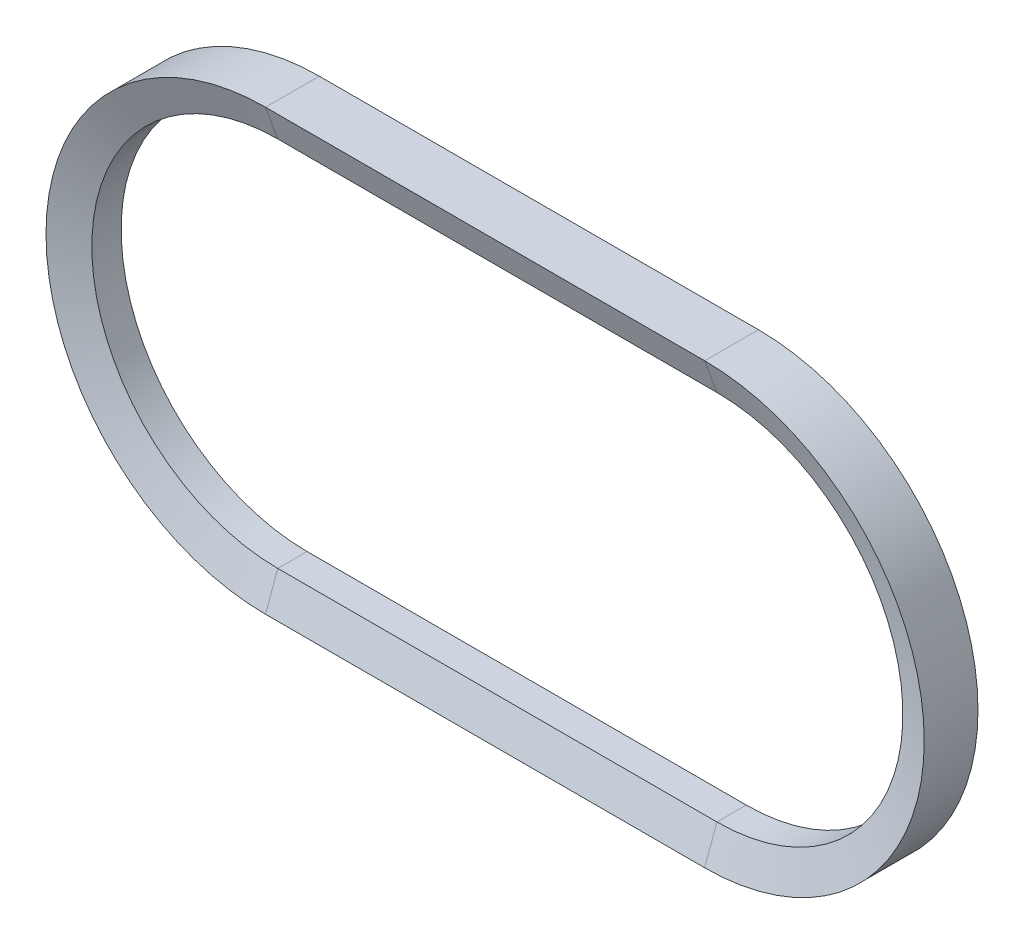
ISO-10303-21;
HEADER;
FILE_DESCRIPTION(('STEP AP214'),'2;1');
FILE_NAME('part.step','',(''),(''),'','','');
FILE_SCHEMA(('AUTOMOTIVE_DESIGN { 1 0 10303 214 1 1 1 1 }'));
ENDSEC;
DATA;
#1=APPLICATION_CONTEXT('core data for automotive mechanical design processes');
#2=APPLICATION_PROTOCOL_DEFINITION('international standard','automotive_design',2000,#1);
#3=PRODUCT_CONTEXT('',#1,'mechanical');
#4=PRODUCT('Part','Part','',(#3));
#5=PRODUCT_RELATED_PRODUCT_CATEGORY('part','',(#4));
#6=PRODUCT_DEFINITION_FORMATION('','',#4);
#7=PRODUCT_DEFINITION_CONTEXT('part definition',#1,'design');
#8=PRODUCT_DEFINITION('design','',#6,#7);
#9=PRODUCT_DEFINITION_SHAPE('','',#8);
#10=(LENGTH_UNIT() NAMED_UNIT(*) SI_UNIT(.MILLI.,.METRE.));
#11=(NAMED_UNIT(*) PLANE_ANGLE_UNIT() SI_UNIT($,.RADIAN.));
#12=(NAMED_UNIT(*) SI_UNIT($,.STERADIAN.) SOLID_ANGLE_UNIT());
#13=UNCERTAINTY_MEASURE_WITH_UNIT(LENGTH_MEASURE(1.E-05),#10,'distance_accuracy_value','');
#14=(GEOMETRIC_REPRESENTATION_CONTEXT(3) GLOBAL_UNCERTAINTY_ASSIGNED_CONTEXT((#13)) GLOBAL_UNIT_ASSIGNED_CONTEXT((#10,
#11,#12)) REPRESENTATION_CONTEXT('',''));
#15=CARTESIAN_POINT('',(0.,0.,0.));
#16=DIRECTION('',(0.,0.,1.));
#17=DIRECTION('',(1.,0.,0.));
#18=AXIS2_PLACEMENT_3D('',#15,#16,#17);
#19=CARTESIAN_POINT('',(0.,51.8710870286063,-6.35));
#20=DIRECTION('',(0.,-1.,0.));
#21=DIRECTION('',(1.,0.,0.));
#22=AXIS2_PLACEMENT_3D('',#19,#20,#21);
#23=PLANE('',#22);
#24=DIRECTION('',(-1.,0.,0.));
#25=VECTOR('',#24,1.);
#26=CARTESIAN_POINT('',(0.,51.8710870286063,6.35));
#27=LINE('',#26,#25);
#28=CARTESIAN_POINT('',(51.8710870286066,51.871087028606,6.35));
#29=VERTEX_POINT('',#28);
#30=CARTESIAN_POINT('',(-51.8710870286066,51.8710870286062,6.35));
#31=VERTEX_POINT('',#30);
#32=EDGE_CURVE('E141',#29,#31,#27,.T.);
#33=ORIENTED_EDGE('',*,*,#32,.F.);
#34=DIRECTION('',(0.,0.,1.));
#35=VECTOR('',#34,1.);
#36=CARTESIAN_POINT('',(51.8710870286066,51.871087028606,-6.35));
#37=LINE('',#36,#35);
#38=CARTESIAN_POINT('',(51.8710870286066,51.871087028606,-6.35));
#39=VERTEX_POINT('',#38);
#40=EDGE_CURVE('E130',#39,#29,#37,.T.);
#41=ORIENTED_EDGE('',*,*,#40,.F.);
#42=DIRECTION('',(-1.,0.,0.));
#43=VECTOR('',#42,1.);
#44=CARTESIAN_POINT('',(0.,51.8710870286063,-6.35));
#45=LINE('',#44,#43);
#46=CARTESIAN_POINT('',(-51.8710870286066,51.8710870286062,-6.35));
#47=VERTEX_POINT('',#46);
#48=EDGE_CURVE('E126',#39,#47,#45,.T.);
#49=ORIENTED_EDGE('',*,*,#48,.T.);
#50=DIRECTION('',(0.,0.,1.));
#51=VECTOR('',#50,1.);
#52=CARTESIAN_POINT('',(-51.8710870286066,51.8710870286062,-6.35));
#53=LINE('',#52,#51);
#54=EDGE_CURVE('E128',#47,#31,#53,.T.);
#55=ORIENTED_EDGE('',*,*,#54,.T.);
#56=EDGE_LOOP('',(#33,#41,#49,#55));
#57=FACE_BOUND('',#56,.T.);
#58=ADVANCED_FACE('F32',(#57),#23,.F.);
#59=CARTESIAN_POINT('',(0.,51.8710870286063,6.35));
#60=DIRECTION('',(0.,0.34202014332567,-0.939692620785908));
#61=DIRECTION('',(0.,0.939692620785908,0.34202014332567));
#62=AXIS2_PLACEMENT_3D('',#59,#60,#61);
#63=PLANE('',#62);
#64=DIRECTION('',(-1.,0.,0.));
#65=VECTOR('',#64,1.);
#66=CARTESIAN_POINT('',(0.,43.9335870286063,3.46098626551201));
#67=LINE('',#66,#65);
#68=CARTESIAN_POINT('',(51.8710870286066,43.933587028606,3.46098626551201));
#69=VERTEX_POINT('',#68);
#70=CARTESIAN_POINT('',(-51.8710870286066,43.9335870286063,3.46098626551201));
#71=VERTEX_POINT('',#70);
#72=EDGE_CURVE('E56',#69,#71,#67,.T.);
#73=ORIENTED_EDGE('',*,*,#72,.F.);
#74=DIRECTION('',(0.,-0.939692620785908,-0.34202014332567));
#75=VECTOR('',#74,1.);
#76=CARTESIAN_POINT('',(51.8710870286066,51.871087028606,6.35));
#77=LINE('',#76,#75);
#78=EDGE_CURVE('E168',#29,#69,#77,.T.);
#79=ORIENTED_EDGE('',*,*,#78,.F.);
#80=ORIENTED_EDGE('',*,*,#32,.T.);
#81=DIRECTION('',(0.,-0.939692620785908,-0.34202014332567));
#82=VECTOR('',#81,1.);
#83=CARTESIAN_POINT('',(-51.8710870286066,51.8710870286062,6.35));
#84=LINE('',#83,#82);
#85=EDGE_CURVE('E171',#31,#71,#84,.T.);
#86=ORIENTED_EDGE('',*,*,#85,.T.);
#87=EDGE_LOOP('',(#73,#79,#80,#86));
#88=FACE_BOUND('',#87,.T.);
#89=ADVANCED_FACE('F213',(#88),#63,.F.);
#90=CARTESIAN_POINT('',(0.,43.9335870286063,3.46098626551201));
#91=DIRECTION('',(0.,1.,0.));
#92=DIRECTION('',(-1.,0.,0.));
#93=AXIS2_PLACEMENT_3D('',#90,#91,#92);
#94=PLANE('',#93);
#95=DIRECTION('',(-1.,0.,0.));
#96=VECTOR('',#95,1.);
#97=CARTESIAN_POINT('',(0.,43.9335870286063,-3.46098626551201));
#98=LINE('',#97,#96);
#99=CARTESIAN_POINT('',(51.8710870286066,43.933587028606,-3.46098626551201));
#100=VERTEX_POINT('',#99);
#101=CARTESIAN_POINT('',(-51.8710870286066,43.9335870286063,-3.46098626551201));
#102=VERTEX_POINT('',#101);
#103=EDGE_CURVE('E47',#100,#102,#98,.T.);
#104=ORIENTED_EDGE('',*,*,#103,.F.);
#105=DIRECTION('',(0.,0.,-1.));
#106=VECTOR('',#105,1.);
#107=CARTESIAN_POINT('',(51.8710870286066,43.933587028606,3.46098626551201));
#108=LINE('',#107,#106);
#109=EDGE_CURVE('E186',#69,#100,#108,.T.);
#110=ORIENTED_EDGE('',*,*,#109,.F.);
#111=ORIENTED_EDGE('',*,*,#72,.T.);
#112=DIRECTION('',(0.,0.,-1.));
#113=VECTOR('',#112,1.);
#114=CARTESIAN_POINT('',(-51.8710870286066,43.9335870286063,3.46098626551201));
#115=LINE('',#114,#113);
#116=EDGE_CURVE('E174',#71,#102,#115,.T.);
#117=ORIENTED_EDGE('',*,*,#116,.T.);
#118=EDGE_LOOP('',(#104,#110,#111,#117));
#119=FACE_BOUND('',#118,.T.);
#120=ADVANCED_FACE('F212',(#119),#94,.F.);
#121=CARTESIAN_POINT('',(0.,51.8710870286063,-6.35));
#122=DIRECTION('',(0.,0.34202014332567,0.939692620785908));
#123=DIRECTION('',(0.,-0.939692620785908,0.34202014332567));
#124=AXIS2_PLACEMENT_3D('',#121,#122,#123);
#125=PLANE('',#124);
#126=DIRECTION('',(0.,0.939692620785908,-0.34202014332567));
#127=VECTOR('',#126,1.);
#128=CARTESIAN_POINT('',(-51.8710870286066,51.8710870286062,-6.35));
#129=LINE('',#128,#127);
#130=EDGE_CURVE('E144',#102,#47,#129,.T.);
#131=ORIENTED_EDGE('',*,*,#130,.T.);
#132=ORIENTED_EDGE('',*,*,#48,.F.);
#133=DIRECTION('',(0.,0.939692620785908,-0.34202014332567));
#134=VECTOR('',#133,1.);
#135=CARTESIAN_POINT('',(51.8710870286066,51.871087028606,-6.35));
#136=LINE('',#135,#134);
#137=EDGE_CURVE('E11',#100,#39,#136,.T.);
#138=ORIENTED_EDGE('',*,*,#137,.F.);
#139=ORIENTED_EDGE('',*,*,#103,.T.);
#140=EDGE_LOOP('',(#131,#132,#138,#139));
#141=FACE_BOUND('',#140,.T.);
#142=ADVANCED_FACE('F145',(#141),#125,.F.);
#143=CARTESIAN_POINT('',(-51.8710870286066,-2.77555756156289E-13,0.));
#144=DIRECTION('',(0.,0.,1.));
#145=DIRECTION('',(1.,0.,0.));
#146=AXIS2_PLACEMENT_3D('',#143,#144,#145);
#147=CYLINDRICAL_SURFACE('',#146,51.8710870286063);
#148=CARTESIAN_POINT('',(-51.8710870286066,-2.77555756156289E-13,6.35));
#149=DIRECTION('',(0.,0.,1.));
#150=DIRECTION('',(0.,1.,0.));
#151=AXIS2_PLACEMENT_3D('',#148,#149,#150);
#152=CIRCLE('',#151,51.8710870286063);
#153=CARTESIAN_POINT('',(-51.8710870286066,-51.8710870286066,6.35));
#154=VERTEX_POINT('',#153);
#155=EDGE_CURVE('E114',#31,#154,#152,.T.);
#156=ORIENTED_EDGE('',*,*,#155,.F.);
#157=ORIENTED_EDGE('',*,*,#54,.F.);
#158=CARTESIAN_POINT('',(-51.8710870286066,-2.77555756156289E-13,-6.35));
#159=DIRECTION('',(0.,0.,1.));
#160=DIRECTION('',(0.,1.,0.));
#161=AXIS2_PLACEMENT_3D('',#158,#159,#160);
#162=CIRCLE('',#161,51.8710870286063);
#163=CARTESIAN_POINT('',(-51.8710870286066,-51.8710870286066,-6.35));
#164=VERTEX_POINT('',#163);
#165=EDGE_CURVE('E139',#47,#164,#162,.T.);
#166=ORIENTED_EDGE('',*,*,#165,.T.);
#167=DIRECTION('',(0.,0.,1.));
#168=VECTOR('',#167,1.);
#169=CARTESIAN_POINT('',(-51.8710870286066,-51.8710870286066,-6.35));
#170=LINE('',#169,#168);
#171=EDGE_CURVE('E152',#164,#154,#170,.T.);
#172=ORIENTED_EDGE('',*,*,#171,.T.);
#173=EDGE_LOOP('',(#156,#157,#166,#172));
#174=FACE_BOUND('',#173,.T.);
#175=ADVANCED_FACE('F137',(#174),#147,.T.);
#176=CARTESIAN_POINT('',(-51.8710870286066,-2.77555756156289E-13,6.35));
#177=DIRECTION('',(0.,0.,1.));
#178=DIRECTION('',(1.,0.,0.));
#179=AXIS2_PLACEMENT_3D('',#176,#177,#178);
#180=CONICAL_SURFACE('',#179,51.8710870286063,1.22173047639603);
#181=CARTESIAN_POINT('',(-51.8710870286066,-2.77555756156289E-13,3.46098626551201));
#182=DIRECTION('',(0.,0.,1.));
#183=DIRECTION('',(0.,1.,0.));
#184=AXIS2_PLACEMENT_3D('',#181,#182,#183);
#185=CIRCLE('',#184,43.9335870286063);
#186=CARTESIAN_POINT('',(-51.8710870286066,-43.9335870286066,3.46098626551201));
#187=VERTEX_POINT('',#186);
#188=EDGE_CURVE('E108',#71,#187,#185,.T.);
#189=ORIENTED_EDGE('',*,*,#188,.F.);
#190=ORIENTED_EDGE('',*,*,#85,.F.);
#191=ORIENTED_EDGE('',*,*,#155,.T.);
#192=DIRECTION('',(0.,0.939692620785908,-0.34202014332567));
#193=VECTOR('',#192,1.);
#194=CARTESIAN_POINT('',(-51.8710870286066,-51.8710870286066,6.35));
#195=LINE('',#194,#193);
#196=EDGE_CURVE('E175',#154,#187,#195,.T.);
#197=ORIENTED_EDGE('',*,*,#196,.T.);
#198=EDGE_LOOP('',(#189,#190,#191,#197));
#199=FACE_BOUND('',#198,.T.);
#200=ADVANCED_FACE('F209',(#199),#180,.F.);
#201=CARTESIAN_POINT('',(-51.8710870286066,-2.77555756156289E-13,0.));
#202=DIRECTION('',(0.,0.,1.));
#203=DIRECTION('',(1.,0.,0.));
#204=AXIS2_PLACEMENT_3D('',#201,#202,#203);
#205=CYLINDRICAL_SURFACE('',#204,43.9335870286063);
#206=CARTESIAN_POINT('',(-51.8710870286066,-2.77555756156289E-13,-3.46098626551201));
#207=DIRECTION('',(0.,0.,1.));
#208=DIRECTION('',(0.,1.,0.));
#209=AXIS2_PLACEMENT_3D('',#206,#207,#208);
#210=CIRCLE('',#209,43.9335870286063);
#211=CARTESIAN_POINT('',(-51.8710870286066,-43.9335870286066,-3.46098626551201));
#212=VERTEX_POINT('',#211);
#213=EDGE_CURVE('E190',#102,#212,#210,.T.);
#214=ORIENTED_EDGE('',*,*,#213,.F.);
#215=ORIENTED_EDGE('',*,*,#116,.F.);
#216=ORIENTED_EDGE('',*,*,#188,.T.);
#217=DIRECTION('',(0.,0.,-1.));
#218=VECTOR('',#217,1.);
#219=CARTESIAN_POINT('',(-51.8710870286066,-43.9335870286066,3.46098626551201));
#220=LINE('',#219,#218);
#221=EDGE_CURVE('E178',#187,#212,#220,.T.);
#222=ORIENTED_EDGE('',*,*,#221,.T.);
#223=EDGE_LOOP('',(#214,#215,#216,#222));
#224=FACE_BOUND('',#223,.T.);
#225=ADVANCED_FACE('F211',(#224),#205,.F.);
#226=CARTESIAN_POINT('',(-51.8710870286066,-2.77555756156289E-13,-3.46098626551201));
#227=DIRECTION('',(0.,0.,-1.));
#228=DIRECTION('',(-1.,0.,0.));
#229=AXIS2_PLACEMENT_3D('',#226,#227,#228);
#230=CONICAL_SURFACE('',#229,43.9335870286063,1.22173047639603);
#231=DIRECTION('',(0.,-0.939692620785908,-0.34202014332567));
#232=VECTOR('',#231,1.);
#233=CARTESIAN_POINT('',(-51.8710870286066,-51.8710870286066,-6.35));
#234=LINE('',#233,#232);
#235=EDGE_CURVE('E150',#212,#164,#234,.T.);
#236=ORIENTED_EDGE('',*,*,#235,.T.);
#237=ORIENTED_EDGE('',*,*,#165,.F.);
#238=ORIENTED_EDGE('',*,*,#130,.F.);
#239=ORIENTED_EDGE('',*,*,#213,.T.);
#240=EDGE_LOOP('',(#236,#237,#238,#239));
#241=FACE_BOUND('',#240,.T.);
#242=ADVANCED_FACE('F149',(#241),#230,.F.);
#243=CARTESIAN_POINT('',(-51.8710870286066,-51.8710870286063,-6.35));
#244=DIRECTION('',(0.,1.,0.));
#245=DIRECTION('',(-1.,0.,0.));
#246=AXIS2_PLACEMENT_3D('',#243,#244,#245);
#247=PLANE('',#246);
#248=DIRECTION('',(1.,0.,0.));
#249=VECTOR('',#248,1.);
#250=CARTESIAN_POINT('',(-51.8710870286066,-51.8710870286063,6.35));
#251=LINE('',#250,#249);
#252=CARTESIAN_POINT('',(51.8710870286066,-51.8710870286063,6.35));
#253=VERTEX_POINT('',#252);
#254=EDGE_CURVE('E95',#154,#253,#251,.T.);
#255=ORIENTED_EDGE('',*,*,#254,.F.);
#256=ORIENTED_EDGE('',*,*,#171,.F.);
#257=DIRECTION('',(1.,0.,0.));
#258=VECTOR('',#257,1.);
#259=CARTESIAN_POINT('',(-51.8710870286066,-51.8710870286063,-6.35));
#260=LINE('',#259,#258);
#261=CARTESIAN_POINT('',(51.8710870286066,-51.8710870286063,-6.35));
#262=VERTEX_POINT('',#261);
#263=EDGE_CURVE('E161',#164,#262,#260,.T.);
#264=ORIENTED_EDGE('',*,*,#263,.T.);
#265=DIRECTION('',(0.,0.,1.));
#266=VECTOR('',#265,1.);
#267=CARTESIAN_POINT('',(51.8710870286066,-51.8710870286063,-6.35));
#268=LINE('',#267,#266);
#269=EDGE_CURVE('E157',#262,#253,#268,.T.);
#270=ORIENTED_EDGE('',*,*,#269,.T.);
#271=EDGE_LOOP('',(#255,#256,#264,#270));
#272=FACE_BOUND('',#271,.T.);
#273=ADVANCED_FACE('F207',(#272),#247,.F.);
#274=CARTESIAN_POINT('',(-51.8710870286066,-51.8710870286063,6.35));
#275=DIRECTION('',(0.,-0.34202014332567,-0.939692620785908));
#276=DIRECTION('',(0.,0.939692620785908,-0.34202014332567));
#277=AXIS2_PLACEMENT_3D('',#274,#275,#276);
#278=PLANE('',#277);
#279=DIRECTION('',(1.,0.,0.));
#280=VECTOR('',#279,1.);
#281=CARTESIAN_POINT('',(-51.8710870286066,-43.9335870286064,3.46098626551201));
#282=LINE('',#281,#280);
#283=CARTESIAN_POINT('',(51.8710870286066,-43.9335870286063,3.46098626551201));
#284=VERTEX_POINT('',#283);
#285=EDGE_CURVE('E88',#187,#284,#282,.T.);
#286=ORIENTED_EDGE('',*,*,#285,.F.);
#287=ORIENTED_EDGE('',*,*,#196,.F.);
#288=ORIENTED_EDGE('',*,*,#254,.T.);
#289=DIRECTION('',(0.,0.939692620785908,-0.34202014332567));
#290=VECTOR('',#289,1.);
#291=CARTESIAN_POINT('',(51.8710870286066,-51.8710870286063,6.35));
#292=LINE('',#291,#290);
#293=EDGE_CURVE('E159',#253,#284,#292,.T.);
#294=ORIENTED_EDGE('',*,*,#293,.T.);
#295=EDGE_LOOP('',(#286,#287,#288,#294));
#296=FACE_BOUND('',#295,.T.);
#297=ADVANCED_FACE('F208',(#296),#278,.F.);
#298=CARTESIAN_POINT('',(-51.8710870286066,-43.9335870286064,3.46098626551201));
#299=DIRECTION('',(0.,-1.,0.));
#300=DIRECTION('',(1.,0.,0.));
#301=AXIS2_PLACEMENT_3D('',#298,#299,#300);
#302=PLANE('',#301);
#303=DIRECTION('',(1.,0.,0.));
#304=VECTOR('',#303,1.);
#305=CARTESIAN_POINT('',(-51.8710870286066,-43.9335870286064,-3.46098626551201));
#306=LINE('',#305,#304);
#307=CARTESIAN_POINT('',(51.8710870286066,-43.9335870286063,-3.46098626551201));
#308=VERTEX_POINT('',#307);
#309=EDGE_CURVE('E79',#212,#308,#306,.T.);
#310=ORIENTED_EDGE('',*,*,#309,.F.);
#311=ORIENTED_EDGE('',*,*,#221,.F.);
#312=ORIENTED_EDGE('',*,*,#285,.T.);
#313=DIRECTION('',(0.,0.,-1.));
#314=VECTOR('',#313,1.);
#315=CARTESIAN_POINT('',(51.8710870286066,-43.9335870286063,3.46098626551201));
#316=LINE('',#315,#314);
#317=EDGE_CURVE('E180',#284,#308,#316,.T.);
#318=ORIENTED_EDGE('',*,*,#317,.T.);
#319=EDGE_LOOP('',(#310,#311,#312,#318));
#320=FACE_BOUND('',#319,.T.);
#321=ADVANCED_FACE('F222',(#320),#302,.F.);
#322=CARTESIAN_POINT('',(-51.8710870286066,-51.8710870286063,-6.35));
#323=DIRECTION('',(0.,-0.34202014332567,0.939692620785908));
#324=DIRECTION('',(0.,-0.939692620785908,-0.34202014332567));
#325=AXIS2_PLACEMENT_3D('',#322,#323,#324);
#326=PLANE('',#325);
#327=DIRECTION('',(0.,-0.939692620785908,-0.34202014332567));
#328=VECTOR('',#327,1.);
#329=CARTESIAN_POINT('',(51.8710870286066,-51.8710870286063,-6.35));
#330=LINE('',#329,#328);
#331=EDGE_CURVE('E170',#308,#262,#330,.T.);
#332=ORIENTED_EDGE('',*,*,#331,.T.);
#333=ORIENTED_EDGE('',*,*,#263,.F.);
#334=ORIENTED_EDGE('',*,*,#235,.F.);
#335=ORIENTED_EDGE('',*,*,#309,.T.);
#336=EDGE_LOOP('',(#332,#333,#334,#335));
#337=FACE_BOUND('',#336,.T.);
#338=ADVANCED_FACE('F199',(#337),#326,.F.);
#339=CARTESIAN_POINT('',(51.8710870286066,-2.67369859245349E-13,0.));
#340=DIRECTION('',(0.,0.,1.));
#341=DIRECTION('',(1.,0.,0.));
#342=AXIS2_PLACEMENT_3D('',#339,#340,#341);
#343=CYLINDRICAL_SURFACE('',#342,51.8710870286063);
#344=CARTESIAN_POINT('',(51.8710870286066,-2.67369859245349E-13,6.35));
#345=DIRECTION('',(0.,0.,1.));
#346=DIRECTION('',(0.,-1.,0.));
#347=AXIS2_PLACEMENT_3D('',#344,#345,#346);
#348=CIRCLE('',#347,51.8710870286063);
#349=EDGE_CURVE('E164',#253,#29,#348,.T.);
#350=ORIENTED_EDGE('',*,*,#349,.F.);
#351=ORIENTED_EDGE('',*,*,#269,.F.);
#352=CARTESIAN_POINT('',(51.8710870286066,-2.67369859245349E-13,-6.35));
#353=DIRECTION('',(0.,0.,1.));
#354=DIRECTION('',(0.,-1.,0.));
#355=AXIS2_PLACEMENT_3D('',#352,#353,#354);
#356=CIRCLE('',#355,51.8710870286063);
#357=EDGE_CURVE('E165',#262,#39,#356,.T.);
#358=ORIENTED_EDGE('',*,*,#357,.T.);
#359=ORIENTED_EDGE('',*,*,#40,.T.);
#360=EDGE_LOOP('',(#350,#351,#358,#359));
#361=FACE_BOUND('',#360,.T.);
#362=ADVANCED_FACE('F204',(#361),#343,.T.);
#363=CARTESIAN_POINT('',(51.8710870286066,-2.67369859245349E-13,6.35));
#364=DIRECTION('',(0.,0.,1.));
#365=DIRECTION('',(1.,0.,0.));
#366=AXIS2_PLACEMENT_3D('',#363,#364,#365);
#367=CONICAL_SURFACE('',#366,51.8710870286063,1.22173047639603);
#368=CARTESIAN_POINT('',(51.8710870286066,-2.67369859245349E-13,3.46098626551201));
#369=DIRECTION('',(0.,0.,1.));
#370=DIRECTION('',(0.,-1.,0.));
#371=AXIS2_PLACEMENT_3D('',#368,#369,#370);
#372=CIRCLE('',#371,43.9335870286063);
#373=EDGE_CURVE('E184',#284,#69,#372,.T.);
#374=ORIENTED_EDGE('',*,*,#373,.F.);
#375=ORIENTED_EDGE('',*,*,#293,.F.);
#376=ORIENTED_EDGE('',*,*,#349,.T.);
#377=ORIENTED_EDGE('',*,*,#78,.T.);
#378=EDGE_LOOP('',(#374,#375,#376,#377));
#379=FACE_BOUND('',#378,.T.);
#380=ADVANCED_FACE('F217',(#379),#367,.F.);
#381=CARTESIAN_POINT('',(51.8710870286066,-2.67369859245349E-13,0.));
#382=DIRECTION('',(0.,0.,1.));
#383=DIRECTION('',(1.,0.,0.));
#384=AXIS2_PLACEMENT_3D('',#381,#382,#383);
#385=CYLINDRICAL_SURFACE('',#384,43.9335870286063);
#386=CARTESIAN_POINT('',(51.8710870286066,-2.67369859245349E-13,-3.46098626551201));
#387=DIRECTION('',(0.,0.,1.));
#388=DIRECTION('',(0.,-1.,0.));
#389=AXIS2_PLACEMENT_3D('',#386,#387,#388);
#390=CIRCLE('',#389,43.9335870286063);
#391=EDGE_CURVE('E40',#308,#100,#390,.T.);
#392=ORIENTED_EDGE('',*,*,#391,.F.);
#393=ORIENTED_EDGE('',*,*,#317,.F.);
#394=ORIENTED_EDGE('',*,*,#373,.T.);
#395=ORIENTED_EDGE('',*,*,#109,.T.);
#396=EDGE_LOOP('',(#392,#393,#394,#395));
#397=FACE_BOUND('',#396,.T.);
#398=ADVANCED_FACE('F221',(#397),#385,.F.);
#399=CARTESIAN_POINT('',(51.8710870286066,-2.67369859245349E-13,-3.46098626551201));
#400=DIRECTION('',(0.,0.,-1.));
#401=DIRECTION('',(-1.,0.,0.));
#402=AXIS2_PLACEMENT_3D('',#399,#400,#401);
#403=CONICAL_SURFACE('',#402,43.9335870286063,1.22173047639603);
#404=ORIENTED_EDGE('',*,*,#137,.T.);
#405=ORIENTED_EDGE('',*,*,#357,.F.);
#406=ORIENTED_EDGE('',*,*,#331,.F.);
#407=ORIENTED_EDGE('',*,*,#391,.T.);
#408=EDGE_LOOP('',(#404,#405,#406,#407));
#409=FACE_BOUND('',#408,.T.);
#410=ADVANCED_FACE('F34',(#409),#403,.F.);
#411=CLOSED_SHELL('',(#58,#89,#120,#142,#175,#200,#225,#242,#273,#297,#321,#338,#362,#380,#398,#410));
#412=MANIFOLD_SOLID_BREP('B2',#411);
#413=ADVANCED_BREP_SHAPE_REPRESENTATION('',(#18,#412),#14);
#414=SHAPE_DEFINITION_REPRESENTATION(#9,#413);
ENDSEC;
END-ISO-10303-21;
